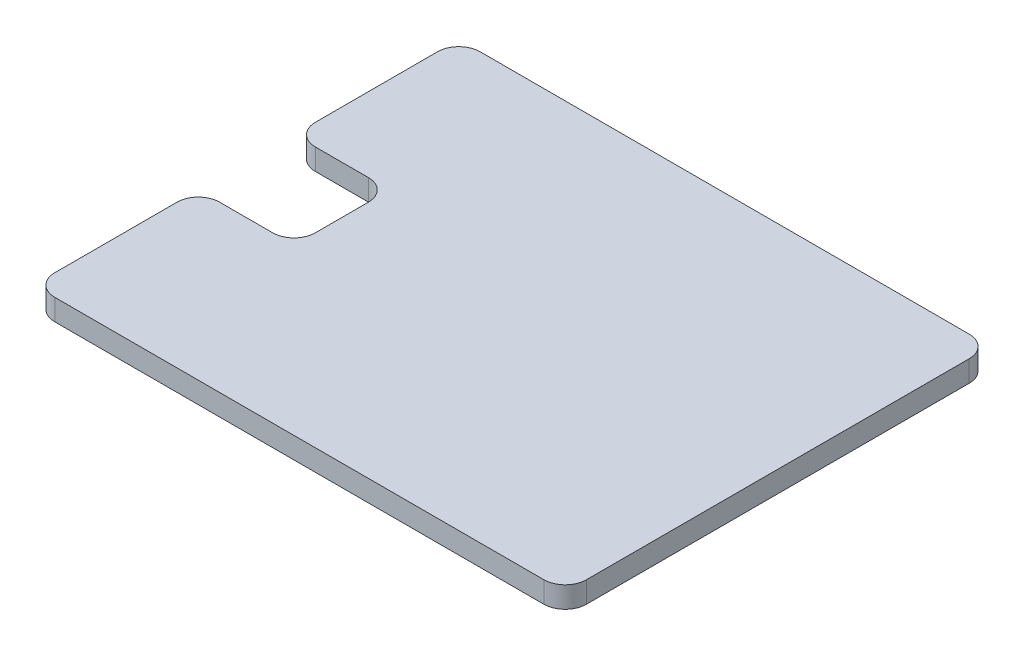
ISO-10303-21;
HEADER;
FILE_DESCRIPTION(('STEP AP214'),'2;1');
FILE_NAME('part.step','',(''),(''),'','','');
FILE_SCHEMA(('AUTOMOTIVE_DESIGN { 1 0 10303 214 1 1 1 1 }'));
ENDSEC;
DATA;
#1=APPLICATION_CONTEXT('core data for automotive mechanical design processes');
#2=APPLICATION_PROTOCOL_DEFINITION('international standard','automotive_design',2000,#1);
#3=PRODUCT_CONTEXT('',#1,'mechanical');
#4=PRODUCT('Part','Part','',(#3));
#5=PRODUCT_RELATED_PRODUCT_CATEGORY('part','',(#4));
#6=PRODUCT_DEFINITION_FORMATION('','',#4);
#7=PRODUCT_DEFINITION_CONTEXT('part definition',#1,'design');
#8=PRODUCT_DEFINITION('design','',#6,#7);
#9=PRODUCT_DEFINITION_SHAPE('','',#8);
#10=(LENGTH_UNIT() NAMED_UNIT(*) SI_UNIT(.MILLI.,.METRE.));
#11=(NAMED_UNIT(*) PLANE_ANGLE_UNIT() SI_UNIT($,.RADIAN.));
#12=(NAMED_UNIT(*) SI_UNIT($,.STERADIAN.) SOLID_ANGLE_UNIT());
#13=UNCERTAINTY_MEASURE_WITH_UNIT(LENGTH_MEASURE(1.E-05),#10,'distance_accuracy_value','');
#14=(GEOMETRIC_REPRESENTATION_CONTEXT(3) GLOBAL_UNCERTAINTY_ASSIGNED_CONTEXT((#13)) GLOBAL_UNIT_ASSIGNED_CONTEXT((#10,
#11,#12)) REPRESENTATION_CONTEXT('',''));
#15=CARTESIAN_POINT('',(0.,0.,0.));
#16=DIRECTION('',(0.,0.,1.));
#17=DIRECTION('',(1.,0.,0.));
#18=AXIS2_PLACEMENT_3D('',#15,#16,#17);
#19=CARTESIAN_POINT('',(0.,13.,0.));
#20=DIRECTION('',(0.,-1.,0.));
#21=DIRECTION('',(0.,0.,-1.));
#22=AXIS2_PLACEMENT_3D('',#19,#20,#21);
#23=PLANE('',#22);
#24=DIRECTION('',(1.,0.,0.));
#25=VECTOR('',#24,1.);
#26=CARTESIAN_POINT('',(0.,13.,16.));
#27=LINE('',#26,#25);
#28=CARTESIAN_POINT('',(-20.5,13.,16.));
#29=VERTEX_POINT('',#28);
#30=CARTESIAN_POINT('',(-15.5,13.,16.));
#31=VERTEX_POINT('',#30);
#32=EDGE_CURVE('E242',#29,#31,#27,.T.);
#33=ORIENTED_EDGE('',*,*,#32,.T.);
#34=DIRECTION('',(0.,0.,-1.));
#35=VECTOR('',#34,1.);
#36=CARTESIAN_POINT('',(-15.5,13.,8.));
#37=LINE('',#36,#35);
#38=CARTESIAN_POINT('',(-15.5,13.,0.));
#39=VERTEX_POINT('',#38);
#40=EDGE_CURVE('E72',#31,#39,#37,.T.);
#41=ORIENTED_EDGE('',*,*,#40,.T.);
#42=DIRECTION('',(1.,0.,0.));
#43=VECTOR('',#42,1.);
#44=CARTESIAN_POINT('',(0.,13.,0.));
#45=LINE('',#44,#43);
#46=CARTESIAN_POINT('',(-20.5,13.,0.));
#47=VERTEX_POINT('',#46);
#48=EDGE_CURVE('E346',#47,#39,#45,.T.);
#49=ORIENTED_EDGE('',*,*,#48,.F.);
#50=DIRECTION('',(0.,0.,-1.));
#51=VECTOR('',#50,1.);
#52=CARTESIAN_POINT('',(-20.5,13.,8.));
#53=LINE('',#52,#51);
#54=CARTESIAN_POINT('',(-20.5,13.,5.5));
#55=VERTEX_POINT('',#54);
#56=EDGE_CURVE('E355',#55,#47,#53,.T.);
#57=ORIENTED_EDGE('',*,*,#56,.F.);
#58=CARTESIAN_POINT('',(-22.5,13.,5.5));
#59=DIRECTION('',(0.,-1.,0.));
#60=DIRECTION('',(0.,0.,-1.));
#61=AXIS2_PLACEMENT_3D('',#58,#59,#60);
#62=CIRCLE('',#61,2.);
#63=CARTESIAN_POINT('',(-22.5,13.,3.5));
#64=VERTEX_POINT('',#63);
#65=EDGE_CURVE('E437',#55,#64,#62,.F.);
#66=ORIENTED_EDGE('',*,*,#65,.T.);
#67=DIRECTION('',(-1.,0.,0.));
#68=VECTOR('',#67,1.);
#69=CARTESIAN_POINT('',(-20.5,13.,3.5));
#70=LINE('',#69,#68);
#71=CARTESIAN_POINT('',(-27.5,13.,3.5));
#72=VERTEX_POINT('',#71);
#73=EDGE_CURVE('E257',#64,#72,#70,.T.);
#74=ORIENTED_EDGE('',*,*,#73,.T.);
#75=CARTESIAN_POINT('',(-27.5,13.,1.5));
#76=DIRECTION('',(0.,-1.,0.));
#77=DIRECTION('',(0.,0.,-1.));
#78=AXIS2_PLACEMENT_3D('',#75,#76,#77);
#79=CIRCLE('',#78,2.);
#80=CARTESIAN_POINT('',(-29.5,13.,1.5));
#81=VERTEX_POINT('',#80);
#82=EDGE_CURVE('E428',#72,#81,#79,.T.);
#83=ORIENTED_EDGE('',*,*,#82,.T.);
#84=DIRECTION('',(0.,0.,1.));
#85=VECTOR('',#84,1.);
#86=CARTESIAN_POINT('',(-29.5,13.,-12.));
#87=LINE('',#86,#85);
#88=CARTESIAN_POINT('',(-29.5,13.,-10.));
#89=VERTEX_POINT('',#88);
#90=EDGE_CURVE('E332',#89,#81,#87,.T.);
#91=ORIENTED_EDGE('',*,*,#90,.F.);
#92=CARTESIAN_POINT('',(-27.5,13.,-10.));
#93=DIRECTION('',(0.,-1.,0.));
#94=DIRECTION('',(0.,0.,-1.));
#95=AXIS2_PLACEMENT_3D('',#92,#93,#94);
#96=CIRCLE('',#95,2.);
#97=CARTESIAN_POINT('',(-27.5,13.,-12.));
#98=VERTEX_POINT('',#97);
#99=EDGE_CURVE('E374',#89,#98,#96,.T.);
#100=ORIENTED_EDGE('',*,*,#99,.T.);
#101=DIRECTION('',(-1.,0.,0.));
#102=VECTOR('',#101,1.);
#103=CARTESIAN_POINT('',(20.5,13.,-12.));
#104=LINE('',#103,#102);
#105=CARTESIAN_POINT('',(18.5,13.,-12.));
#106=VERTEX_POINT('',#105);
#107=EDGE_CURVE('E341',#106,#98,#104,.T.);
#108=ORIENTED_EDGE('',*,*,#107,.F.);
#109=CARTESIAN_POINT('',(18.5,13.,-10.));
#110=DIRECTION('',(0.,-1.,0.));
#111=DIRECTION('',(0.,0.,-1.));
#112=AXIS2_PLACEMENT_3D('',#109,#110,#111);
#113=CIRCLE('',#112,2.);
#114=CARTESIAN_POINT('',(20.5,13.,-10.));
#115=VERTEX_POINT('',#114);
#116=EDGE_CURVE('E378',#106,#115,#113,.T.);
#117=ORIENTED_EDGE('',*,*,#116,.T.);
#118=DIRECTION('',(0.,0.,-1.));
#119=VECTOR('',#118,1.);
#120=CARTESIAN_POINT('',(20.5,13.,-12.));
#121=LINE('',#120,#119);
#122=CARTESIAN_POINT('',(20.5,13.,26.));
#123=VERTEX_POINT('',#122);
#124=EDGE_CURVE('E338',#123,#115,#121,.T.);
#125=ORIENTED_EDGE('',*,*,#124,.F.);
#126=CARTESIAN_POINT('',(18.5,13.,26.));
#127=DIRECTION('',(0.,-1.,0.));
#128=DIRECTION('',(0.,0.,-1.));
#129=AXIS2_PLACEMENT_3D('',#126,#127,#128);
#130=CIRCLE('',#129,2.);
#131=CARTESIAN_POINT('',(18.5,13.,28.));
#132=VERTEX_POINT('',#131);
#133=EDGE_CURVE('E376',#123,#132,#130,.T.);
#134=ORIENTED_EDGE('',*,*,#133,.T.);
#135=DIRECTION('',(1.,0.,0.));
#136=VECTOR('',#135,1.);
#137=CARTESIAN_POINT('',(20.5,13.,28.));
#138=LINE('',#137,#136);
#139=CARTESIAN_POINT('',(-27.5,13.,28.));
#140=VERTEX_POINT('',#139);
#141=EDGE_CURVE('E335',#140,#132,#138,.T.);
#142=ORIENTED_EDGE('',*,*,#141,.F.);
#143=CARTESIAN_POINT('',(-27.5,13.,26.));
#144=DIRECTION('',(0.,-1.,0.));
#145=DIRECTION('',(0.,0.,-1.));
#146=AXIS2_PLACEMENT_3D('',#143,#144,#145);
#147=CIRCLE('',#146,2.);
#148=CARTESIAN_POINT('',(-29.5,13.,26.));
#149=VERTEX_POINT('',#148);
#150=EDGE_CURVE('E371',#140,#149,#147,.T.);
#151=ORIENTED_EDGE('',*,*,#150,.T.);
#152=CARTESIAN_POINT('',(-29.5,13.,14.5));
#153=VERTEX_POINT('',#152);
#154=EDGE_CURVE('E317',#153,#149,#87,.T.);
#155=ORIENTED_EDGE('',*,*,#154,.F.);
#156=CARTESIAN_POINT('',(-27.5,13.,14.5));
#157=DIRECTION('',(0.,-1.,0.));
#158=DIRECTION('',(0.,0.,-1.));
#159=AXIS2_PLACEMENT_3D('',#156,#157,#158);
#160=CIRCLE('',#159,2.);
#161=CARTESIAN_POINT('',(-27.5,13.,12.5));
#162=VERTEX_POINT('',#161);
#163=EDGE_CURVE('E430',#153,#162,#160,.T.);
#164=ORIENTED_EDGE('',*,*,#163,.T.);
#165=DIRECTION('',(1.,0.,0.));
#166=VECTOR('',#165,1.);
#167=CARTESIAN_POINT('',(-20.5,13.,12.5));
#168=LINE('',#167,#166);
#169=CARTESIAN_POINT('',(-22.5,13.,12.5));
#170=VERTEX_POINT('',#169);
#171=EDGE_CURVE('E254',#162,#170,#168,.T.);
#172=ORIENTED_EDGE('',*,*,#171,.T.);
#173=CARTESIAN_POINT('',(-22.5,13.,10.5));
#174=DIRECTION('',(0.,-1.,0.));
#175=DIRECTION('',(0.,0.,-1.));
#176=AXIS2_PLACEMENT_3D('',#173,#174,#175);
#177=CIRCLE('',#176,2.);
#178=CARTESIAN_POINT('',(-20.5,13.,10.5));
#179=VERTEX_POINT('',#178);
#180=EDGE_CURVE('E57',#170,#179,#177,.F.);
#181=ORIENTED_EDGE('',*,*,#180,.T.);
#182=DIRECTION('',(0.,0.,-1.));
#183=VECTOR('',#182,1.);
#184=CARTESIAN_POINT('',(-20.5,13.,16.));
#185=LINE('',#184,#183);
#186=EDGE_CURVE('E64',#29,#179,#185,.T.);
#187=ORIENTED_EDGE('',*,*,#186,.F.);
#188=EDGE_LOOP('',(#33,#41,#49,#57,#66,#74,#83,#91,#100,#108,#117,#125,#134,#142,#151,#155,#164,
#172,#181,#187));
#189=FACE_BOUND('',#188,.T.);
#190=ADVANCED_FACE('F49',(#189),#23,.T.);
#191=CARTESIAN_POINT('',(-29.5,15.,-12.));
#192=DIRECTION('',(1.,0.,0.));
#193=DIRECTION('',(0.,0.,-1.));
#194=AXIS2_PLACEMENT_3D('',#191,#192,#193);
#195=PLANE('',#194);
#196=ORIENTED_EDGE('',*,*,#90,.T.);
#197=DIRECTION('',(0.,1.,0.));
#198=VECTOR('',#197,1.);
#199=CARTESIAN_POINT('',(-29.5,15.,1.5));
#200=LINE('',#199,#198);
#201=CARTESIAN_POINT('',(-29.5,15.,1.5));
#202=VERTEX_POINT('',#201);
#203=EDGE_CURVE('E432',#81,#202,#200,.T.);
#204=ORIENTED_EDGE('',*,*,#203,.T.);
#205=DIRECTION('',(0.,0.,1.));
#206=VECTOR('',#205,1.);
#207=CARTESIAN_POINT('',(-29.5,15.,-12.));
#208=LINE('',#207,#206);
#209=CARTESIAN_POINT('',(-29.5,15.,-10.));
#210=VERTEX_POINT('',#209);
#211=EDGE_CURVE('E318',#210,#202,#208,.T.);
#212=ORIENTED_EDGE('',*,*,#211,.F.);
#213=DIRECTION('',(0.,-1.,0.));
#214=VECTOR('',#213,1.);
#215=CARTESIAN_POINT('',(-29.5,15.,-10.));
#216=LINE('',#215,#214);
#217=EDGE_CURVE('E401',#210,#89,#216,.T.);
#218=ORIENTED_EDGE('',*,*,#217,.T.);
#219=EDGE_LOOP('',(#196,#204,#212,#218));
#220=FACE_BOUND('',#219,.T.);
#221=ADVANCED_FACE('F513',(#220),#195,.F.);
#222=CARTESIAN_POINT('',(0.,0.,0.));
#223=DIRECTION('',(0.,0.,1.));
#224=DIRECTION('',(1.,0.,0.));
#225=AXIS2_PLACEMENT_3D('',#222,#223,#224);
#226=PLANE('',#225);
#227=CARTESIAN_POINT('',(-20.,5.,0.));
#228=DIRECTION('',(0.,0.,1.));
#229=DIRECTION('',(1.,0.,0.));
#230=AXIS2_PLACEMENT_3D('',#227,#228,#229);
#231=CIRCLE('',#230,5.);
#232=CARTESIAN_POINT('',(-21.2924849189812,9.83006032407528,0.));
#233=VERTEX_POINT('',#232);
#234=CARTESIAN_POINT('',(-16.58660256604,8.65358973583999,0.));
#235=VERTEX_POINT('',#234);
#236=EDGE_CURVE('E331',#233,#235,#231,.T.);
#237=ORIENTED_EDGE('',*,*,#236,.F.);
#238=DIRECTION('',(0.242535625036333,0.970142500145332,0.));
#239=VECTOR('',#238,1.);
#240=CARTESIAN_POINT('',(-22.3529411764706,5.58823529411764,0.));
#241=LINE('',#240,#239);
#242=EDGE_CURVE('E350',#233,#47,#241,.T.);
#243=ORIENTED_EDGE('',*,*,#242,.T.);
#244=ORIENTED_EDGE('',*,*,#48,.T.);
#245=DIRECTION('',(0.242535625036333,0.970142500145332,0.));
#246=VECTOR('',#245,1.);
#247=CARTESIAN_POINT('',(-17.6470588235294,4.41176470588235,0.));
#248=LINE('',#247,#246);
#249=EDGE_CURVE('E344',#235,#39,#248,.T.);
#250=ORIENTED_EDGE('',*,*,#249,.F.);
#251=EDGE_LOOP('',(#237,#243,#244,#250));
#252=FACE_BOUND('',#251,.T.);
#253=DIRECTION('',(-1.,0.,0.));
#254=VECTOR('',#253,1.);
#255=CARTESIAN_POINT('',(-18.375,7.81458256229942,0.));
#256=LINE('',#255,#254);
#257=CARTESIAN_POINT('',(-18.375,7.81458256229942,0.));
#258=VERTEX_POINT('',#257);
#259=CARTESIAN_POINT('',(-21.625,7.81458256229942,0.));
#260=VERTEX_POINT('',#259);
#261=EDGE_CURVE('E272',#258,#260,#256,.T.);
#262=ORIENTED_EDGE('',*,*,#261,.T.);
#263=DIRECTION('',(-0.5,-0.866025403784439,0.));
#264=VECTOR('',#263,1.);
#265=CARTESIAN_POINT('',(-21.625,7.81458256229942,0.));
#266=LINE('',#265,#264);
#267=CARTESIAN_POINT('',(-23.25,5.,0.));
#268=VERTEX_POINT('',#267);
#269=EDGE_CURVE('E290',#260,#268,#266,.T.);
#270=ORIENTED_EDGE('',*,*,#269,.T.);
#271=DIRECTION('',(0.500000000000001,-0.866025403784438,0.));
#272=VECTOR('',#271,1.);
#273=CARTESIAN_POINT('',(-23.25,5.,0.));
#274=LINE('',#273,#272);
#275=CARTESIAN_POINT('',(-21.625,2.18541743770057,0.));
#276=VERTEX_POINT('',#275);
#277=EDGE_CURVE('E293',#268,#276,#274,.T.);
#278=ORIENTED_EDGE('',*,*,#277,.T.);
#279=DIRECTION('',(1.,0.,0.));
#280=VECTOR('',#279,1.);
#281=CARTESIAN_POINT('',(-21.625,2.18541743770057,0.));
#282=LINE('',#281,#280);
#283=CARTESIAN_POINT('',(-18.375,2.18541743770057,0.));
#284=VERTEX_POINT('',#283);
#285=EDGE_CURVE('E296',#276,#284,#282,.T.);
#286=ORIENTED_EDGE('',*,*,#285,.T.);
#287=DIRECTION('',(0.5,0.866025403784439,0.));
#288=VECTOR('',#287,1.);
#289=CARTESIAN_POINT('',(-18.375,2.18541743770057,0.));
#290=LINE('',#289,#288);
#291=CARTESIAN_POINT('',(-16.75,5.,0.));
#292=VERTEX_POINT('',#291);
#293=EDGE_CURVE('E299',#284,#292,#290,.T.);
#294=ORIENTED_EDGE('',*,*,#293,.T.);
#295=DIRECTION('',(-0.5,0.866025403784439,0.));
#296=VECTOR('',#295,1.);
#297=CARTESIAN_POINT('',(-16.75,5.,0.));
#298=LINE('',#297,#296);
#299=EDGE_CURVE('E277',#292,#258,#298,.T.);
#300=ORIENTED_EDGE('',*,*,#299,.T.);
#301=EDGE_LOOP('',(#262,#270,#278,#286,#294,#300));
#302=FACE_BOUND('',#301,.T.);
#303=ADVANCED_FACE('F489',(#252,#302),#226,.F.);
#304=CARTESIAN_POINT('',(-17.6470588235294,4.41176470588235,8.));
#305=DIRECTION('',(-0.970142500145332,0.242535625036333,0.));
#306=DIRECTION('',(-0.242535625036333,-0.970142500145332,0.));
#307=AXIS2_PLACEMENT_3D('',#304,#305,#306);
#308=PLANE('',#307);
#309=ORIENTED_EDGE('',*,*,#249,.T.);
#310=ORIENTED_EDGE('',*,*,#40,.F.);
#311=DIRECTION('',(0.242535625036333,0.970142500145332,0.));
#312=VECTOR('',#311,1.);
#313=CARTESIAN_POINT('',(-17.6470588235294,4.41176470588235,16.));
#314=LINE('',#313,#312);
#315=CARTESIAN_POINT('',(-16.58660256604,8.65358973583999,16.));
#316=VERTEX_POINT('',#315);
#317=EDGE_CURVE('E239',#316,#31,#314,.T.);
#318=ORIENTED_EDGE('',*,*,#317,.F.);
#319=DIRECTION('',(0.,0.,-1.));
#320=VECTOR('',#319,1.);
#321=CARTESIAN_POINT('',(-16.58660256604,8.65358973583999,16.));
#322=LINE('',#321,#320);
#323=CARTESIAN_POINT('',(-16.58660256604,8.65358973583999,8.));
#324=VERTEX_POINT('',#323);
#325=EDGE_CURVE('E230',#316,#324,#322,.T.);
#326=ORIENTED_EDGE('',*,*,#325,.T.);
#327=DIRECTION('',(0.,0.,-1.));
#328=VECTOR('',#327,1.);
#329=CARTESIAN_POINT('',(-16.58660256604,8.65358973583999,8.));
#330=LINE('',#329,#328);
#331=EDGE_CURVE('E360',#324,#235,#330,.T.);
#332=ORIENTED_EDGE('',*,*,#331,.T.);
#333=EDGE_LOOP('',(#309,#310,#318,#326,#332));
#334=FACE_BOUND('',#333,.T.);
#335=ADVANCED_FACE('F240',(#334),#308,.F.);
#336=CARTESIAN_POINT('',(-22.3529411764706,5.58823529411764,8.));
#337=DIRECTION('',(-0.970142500145332,0.242535625036333,0.));
#338=DIRECTION('',(-0.242535625036333,-0.970142500145332,0.));
#339=AXIS2_PLACEMENT_3D('',#336,#337,#338);
#340=PLANE('',#339);
#341=ORIENTED_EDGE('',*,*,#242,.F.);
#342=DIRECTION('',(0.,0.,-1.));
#343=VECTOR('',#342,1.);
#344=CARTESIAN_POINT('',(-21.2924849189812,9.83006032407528,8.));
#345=LINE('',#344,#343);
#346=CARTESIAN_POINT('',(-21.2924849189812,9.83006032407528,8.));
#347=VERTEX_POINT('',#346);
#348=EDGE_CURVE('E353',#347,#233,#345,.T.);
#349=ORIENTED_EDGE('',*,*,#348,.F.);
#350=DIRECTION('',(0.,0.,-1.));
#351=VECTOR('',#350,1.);
#352=CARTESIAN_POINT('',(-21.2924849189812,9.83006032407528,16.));
#353=LINE('',#352,#351);
#354=CARTESIAN_POINT('',(-21.2924849189812,9.83006032407528,16.));
#355=VERTEX_POINT('',#354);
#356=EDGE_CURVE('E251',#355,#347,#353,.T.);
#357=ORIENTED_EDGE('',*,*,#356,.F.);
#358=DIRECTION('',(0.242535625036333,0.970142500145332,0.));
#359=VECTOR('',#358,1.);
#360=CARTESIAN_POINT('',(-22.3529411764706,5.58823529411764,16.));
#361=LINE('',#360,#359);
#362=EDGE_CURVE('E246',#355,#29,#361,.T.);
#363=ORIENTED_EDGE('',*,*,#362,.T.);
#364=ORIENTED_EDGE('',*,*,#186,.T.);
#365=EDGE_CURVE('E356',#179,#55,#53,.T.);
#366=ORIENTED_EDGE('',*,*,#365,.T.);
#367=ORIENTED_EDGE('',*,*,#56,.T.);
#368=EDGE_LOOP('',(#341,#349,#357,#363,#364,#366,#367));
#369=FACE_BOUND('',#368,.T.);
#370=ADVANCED_FACE('F450',(#369),#340,.T.);
#371=CARTESIAN_POINT('',(0.,0.,8.));
#372=DIRECTION('',(0.,0.,1.));
#373=DIRECTION('',(1.,0.,0.));
#374=AXIS2_PLACEMENT_3D('',#371,#372,#373);
#375=PLANE('',#374);
#376=CARTESIAN_POINT('',(-20.,5.,8.));
#377=DIRECTION('',(0.,0.,1.));
#378=DIRECTION('',(1.,0.,0.));
#379=AXIS2_PLACEMENT_3D('',#376,#377,#378);
#380=CIRCLE('',#379,5.);
#381=EDGE_CURVE('E12',#347,#324,#380,.F.);
#382=ORIENTED_EDGE('',*,*,#381,.F.);
#383=CARTESIAN_POINT('',(-20.,5.,8.));
#384=DIRECTION('',(0.,0.,1.));
#385=DIRECTION('',(1.,0.,0.));
#386=AXIS2_PLACEMENT_3D('',#383,#384,#385);
#387=CIRCLE('',#386,5.);
#388=EDGE_CURVE('E347',#347,#324,#387,.T.);
#389=ORIENTED_EDGE('',*,*,#388,.T.);
#390=EDGE_LOOP('',(#382,#389));
#391=FACE_BOUND('',#390,.T.);
#392=CARTESIAN_POINT('',(-20.,5.,8.));
#393=DIRECTION('',(0.,0.,1.));
#394=DIRECTION('',(1.,0.,0.));
#395=AXIS2_PLACEMENT_3D('',#392,#393,#394);
#396=CIRCLE('',#395,1.6);
#397=CARTESIAN_POINT('',(-18.4,5.,8.));
#398=VERTEX_POINT('',#397);
#399=EDGE_CURVE('E269',#398,#398,#396,.T.);
#400=ORIENTED_EDGE('',*,*,#399,.F.);
#401=EDGE_LOOP('',(#400));
#402=FACE_BOUND('',#401,.T.);
#403=ADVANCED_FACE('F458',(#391,#402),#375,.T.);
#404=CARTESIAN_POINT('',(-20.,5.,8.));
#405=DIRECTION('',(0.,0.,-1.));
#406=DIRECTION('',(-1.,0.,0.));
#407=AXIS2_PLACEMENT_3D('',#404,#405,#406);
#408=CYLINDRICAL_SURFACE('',#407,5.);
#409=ORIENTED_EDGE('',*,*,#236,.T.);
#410=ORIENTED_EDGE('',*,*,#331,.F.);
#411=ORIENTED_EDGE('',*,*,#388,.F.);
#412=ORIENTED_EDGE('',*,*,#348,.T.);
#413=EDGE_LOOP('',(#409,#410,#411,#412));
#414=FACE_BOUND('',#413,.T.);
#415=ADVANCED_FACE('F456',(#414),#408,.T.);
#416=CARTESIAN_POINT('',(-29.5,15.,14.5));
#417=VERTEX_POINT('',#416);
#418=CARTESIAN_POINT('',(-29.5,15.,26.));
#419=VERTEX_POINT('',#418);
#420=EDGE_CURVE('E322',#417,#419,#208,.T.);
#421=ORIENTED_EDGE('',*,*,#420,.F.);
#422=DIRECTION('',(0.,1.,0.));
#423=VECTOR('',#422,1.);
#424=CARTESIAN_POINT('',(-29.5,15.,14.5));
#425=LINE('',#424,#423);
#426=EDGE_CURVE('E426',#417,#153,#425,.F.);
#427=ORIENTED_EDGE('',*,*,#426,.T.);
#428=ORIENTED_EDGE('',*,*,#154,.T.);
#429=DIRECTION('',(0.,-1.,0.));
#430=VECTOR('',#429,1.);
#431=CARTESIAN_POINT('',(-29.5,15.,26.));
#432=LINE('',#431,#430);
#433=EDGE_CURVE('E398',#149,#419,#432,.F.);
#434=ORIENTED_EDGE('',*,*,#433,.T.);
#435=EDGE_LOOP('',(#421,#427,#428,#434));
#436=FACE_BOUND('',#435,.T.);
#437=ADVANCED_FACE('F520',(#436),#195,.F.);
#438=CARTESIAN_POINT('',(20.5,15.,28.));
#439=DIRECTION('',(0.,0.,-1.));
#440=DIRECTION('',(-1.,0.,0.));
#441=AXIS2_PLACEMENT_3D('',#438,#439,#440);
#442=PLANE('',#441);
#443=ORIENTED_EDGE('',*,*,#141,.T.);
#444=DIRECTION('',(0.,-1.,0.));
#445=VECTOR('',#444,1.);
#446=CARTESIAN_POINT('',(18.5,15.,28.));
#447=LINE('',#446,#445);
#448=CARTESIAN_POINT('',(18.5,15.,28.));
#449=VERTEX_POINT('',#448);
#450=EDGE_CURVE('E396',#132,#449,#447,.F.);
#451=ORIENTED_EDGE('',*,*,#450,.T.);
#452=DIRECTION('',(1.,0.,0.));
#453=VECTOR('',#452,1.);
#454=CARTESIAN_POINT('',(20.5,15.,28.));
#455=LINE('',#454,#453);
#456=CARTESIAN_POINT('',(-27.5,15.,28.));
#457=VERTEX_POINT('',#456);
#458=EDGE_CURVE('E321',#457,#449,#455,.T.);
#459=ORIENTED_EDGE('',*,*,#458,.F.);
#460=DIRECTION('',(0.,-1.,0.));
#461=VECTOR('',#460,1.);
#462=CARTESIAN_POINT('',(-27.5,15.,28.));
#463=LINE('',#462,#461);
#464=EDGE_CURVE('E393',#457,#140,#463,.T.);
#465=ORIENTED_EDGE('',*,*,#464,.T.);
#466=EDGE_LOOP('',(#443,#451,#459,#465));
#467=FACE_BOUND('',#466,.T.);
#468=ADVANCED_FACE('F532',(#467),#442,.F.);
#469=CARTESIAN_POINT('',(20.5,15.,-12.));
#470=DIRECTION('',(-1.,0.,0.));
#471=DIRECTION('',(0.,0.,1.));
#472=AXIS2_PLACEMENT_3D('',#469,#470,#471);
#473=PLANE('',#472);
#474=ORIENTED_EDGE('',*,*,#124,.T.);
#475=DIRECTION('',(0.,-1.,0.));
#476=VECTOR('',#475,1.);
#477=CARTESIAN_POINT('',(20.5,15.,-10.));
#478=LINE('',#477,#476);
#479=CARTESIAN_POINT('',(20.5,15.,-10.));
#480=VERTEX_POINT('',#479);
#481=EDGE_CURVE('E383',#115,#480,#478,.F.);
#482=ORIENTED_EDGE('',*,*,#481,.T.);
#483=DIRECTION('',(0.,0.,-1.));
#484=VECTOR('',#483,1.);
#485=CARTESIAN_POINT('',(20.5,15.,-12.));
#486=LINE('',#485,#484);
#487=CARTESIAN_POINT('',(20.5,15.,26.));
#488=VERTEX_POINT('',#487);
#489=EDGE_CURVE('E325',#488,#480,#486,.T.);
#490=ORIENTED_EDGE('',*,*,#489,.F.);
#491=DIRECTION('',(0.,-1.,0.));
#492=VECTOR('',#491,1.);
#493=CARTESIAN_POINT('',(20.5,15.,26.));
#494=LINE('',#493,#492);
#495=EDGE_CURVE('E380',#488,#123,#494,.T.);
#496=ORIENTED_EDGE('',*,*,#495,.T.);
#497=EDGE_LOOP('',(#474,#482,#490,#496));
#498=FACE_BOUND('',#497,.T.);
#499=ADVANCED_FACE('F528',(#498),#473,.F.);
#500=CARTESIAN_POINT('',(20.5,15.,-12.));
#501=DIRECTION('',(0.,0.,1.));
#502=DIRECTION('',(1.,0.,0.));
#503=AXIS2_PLACEMENT_3D('',#500,#501,#502);
#504=PLANE('',#503);
#505=DIRECTION('',(-1.,0.,0.));
#506=VECTOR('',#505,1.);
#507=CARTESIAN_POINT('',(20.5,15.,-12.));
#508=LINE('',#507,#506);
#509=CARTESIAN_POINT('',(18.5,15.,-12.));
#510=VERTEX_POINT('',#509);
#511=CARTESIAN_POINT('',(-27.5,15.,-12.));
#512=VERTEX_POINT('',#511);
#513=EDGE_CURVE('E328',#510,#512,#508,.T.);
#514=ORIENTED_EDGE('',*,*,#513,.F.);
#515=DIRECTION('',(0.,-1.,0.));
#516=VECTOR('',#515,1.);
#517=CARTESIAN_POINT('',(18.5,15.,-12.));
#518=LINE('',#517,#516);
#519=EDGE_CURVE('E368',#510,#106,#518,.T.);
#520=ORIENTED_EDGE('',*,*,#519,.T.);
#521=ORIENTED_EDGE('',*,*,#107,.T.);
#522=DIRECTION('',(0.,-1.,0.));
#523=VECTOR('',#522,1.);
#524=CARTESIAN_POINT('',(-27.5,15.,-12.));
#525=LINE('',#524,#523);
#526=EDGE_CURVE('E362',#98,#512,#525,.F.);
#527=ORIENTED_EDGE('',*,*,#526,.T.);
#528=EDGE_LOOP('',(#514,#520,#521,#527));
#529=FACE_BOUND('',#528,.T.);
#530=ADVANCED_FACE('F525',(#529),#504,.F.);
#531=CARTESIAN_POINT('',(0.,15.,0.));
#532=DIRECTION('',(0.,-1.,0.));
#533=DIRECTION('',(0.,0.,-1.));
#534=AXIS2_PLACEMENT_3D('',#531,#532,#533);
#535=PLANE('',#534);
#536=DIRECTION('',(1.,0.,0.));
#537=VECTOR('',#536,1.);
#538=CARTESIAN_POINT('',(-20.5,15.,12.5));
#539=LINE('',#538,#537);
#540=CARTESIAN_POINT('',(-27.5,15.,12.5));
#541=VERTEX_POINT('',#540);
#542=CARTESIAN_POINT('',(-22.5,15.,12.5));
#543=VERTEX_POINT('',#542);
#544=EDGE_CURVE('E236',#541,#543,#539,.T.);
#545=ORIENTED_EDGE('',*,*,#544,.F.);
#546=CARTESIAN_POINT('',(-27.5,15.,14.5));
#547=DIRECTION('',(0.,-1.,0.));
#548=DIRECTION('',(0.,0.,-1.));
#549=AXIS2_PLACEMENT_3D('',#546,#547,#548);
#550=CIRCLE('',#549,2.);
#551=EDGE_CURVE('E424',#541,#417,#550,.F.);
#552=ORIENTED_EDGE('',*,*,#551,.T.);
#553=ORIENTED_EDGE('',*,*,#420,.T.);
#554=CARTESIAN_POINT('',(-27.5,15.,26.));
#555=DIRECTION('',(0.,-1.,0.));
#556=DIRECTION('',(0.,0.,-1.));
#557=AXIS2_PLACEMENT_3D('',#554,#555,#556);
#558=CIRCLE('',#557,2.);
#559=EDGE_CURVE('E385',#419,#457,#558,.F.);
#560=ORIENTED_EDGE('',*,*,#559,.T.);
#561=ORIENTED_EDGE('',*,*,#458,.T.);
#562=CARTESIAN_POINT('',(18.5,15.,26.));
#563=DIRECTION('',(0.,-1.,0.));
#564=DIRECTION('',(0.,0.,-1.));
#565=AXIS2_PLACEMENT_3D('',#562,#563,#564);
#566=CIRCLE('',#565,2.);
#567=EDGE_CURVE('E389',#449,#488,#566,.F.);
#568=ORIENTED_EDGE('',*,*,#567,.T.);
#569=ORIENTED_EDGE('',*,*,#489,.T.);
#570=CARTESIAN_POINT('',(18.5,15.,-10.));
#571=DIRECTION('',(0.,-1.,0.));
#572=DIRECTION('',(0.,0.,-1.));
#573=AXIS2_PLACEMENT_3D('',#570,#571,#572);
#574=CIRCLE('',#573,2.);
#575=EDGE_CURVE('E391',#480,#510,#574,.F.);
#576=ORIENTED_EDGE('',*,*,#575,.T.);
#577=ORIENTED_EDGE('',*,*,#513,.T.);
#578=CARTESIAN_POINT('',(-27.5,15.,-10.));
#579=DIRECTION('',(0.,-1.,0.));
#580=DIRECTION('',(0.,0.,-1.));
#581=AXIS2_PLACEMENT_3D('',#578,#579,#580);
#582=CIRCLE('',#581,2.);
#583=EDGE_CURVE('E387',#512,#210,#582,.F.);
#584=ORIENTED_EDGE('',*,*,#583,.T.);
#585=ORIENTED_EDGE('',*,*,#211,.T.);
#586=CARTESIAN_POINT('',(-27.5,15.,1.5));
#587=DIRECTION('',(0.,-1.,0.));
#588=DIRECTION('',(0.,0.,-1.));
#589=AXIS2_PLACEMENT_3D('',#586,#587,#588);
#590=CIRCLE('',#589,2.);
#591=CARTESIAN_POINT('',(-27.5,15.,3.5));
#592=VERTEX_POINT('',#591);
#593=EDGE_CURVE('E422',#202,#592,#590,.F.);
#594=ORIENTED_EDGE('',*,*,#593,.T.);
#595=DIRECTION('',(-1.,0.,0.));
#596=VECTOR('',#595,1.);
#597=CARTESIAN_POINT('',(-20.5,15.,3.5));
#598=LINE('',#597,#596);
#599=CARTESIAN_POINT('',(-22.5,15.,3.5));
#600=VERTEX_POINT('',#599);
#601=EDGE_CURVE('E258',#600,#592,#598,.T.);
#602=ORIENTED_EDGE('',*,*,#601,.F.);
#603=CARTESIAN_POINT('',(-22.5,15.,5.5));
#604=DIRECTION('',(0.,-1.,0.));
#605=DIRECTION('',(0.,0.,-1.));
#606=AXIS2_PLACEMENT_3D('',#603,#604,#605);
#607=CIRCLE('',#606,2.);
#608=CARTESIAN_POINT('',(-20.5,15.,5.5));
#609=VERTEX_POINT('',#608);
#610=EDGE_CURVE('E435',#600,#609,#607,.T.);
#611=ORIENTED_EDGE('',*,*,#610,.T.);
#612=DIRECTION('',(0.,0.,-1.));
#613=VECTOR('',#612,1.);
#614=CARTESIAN_POINT('',(-20.5,15.,3.5));
#615=LINE('',#614,#613);
#616=CARTESIAN_POINT('',(-20.5,15.,10.5));
#617=VERTEX_POINT('',#616);
#618=EDGE_CURVE('E264',#617,#609,#615,.T.);
#619=ORIENTED_EDGE('',*,*,#618,.F.);
#620=CARTESIAN_POINT('',(-22.5,15.,10.5));
#621=DIRECTION('',(0.,-1.,0.));
#622=DIRECTION('',(0.,0.,-1.));
#623=AXIS2_PLACEMENT_3D('',#620,#621,#622);
#624=CIRCLE('',#623,2.);
#625=EDGE_CURVE('E439',#617,#543,#624,.T.);
#626=ORIENTED_EDGE('',*,*,#625,.T.);
#627=EDGE_LOOP('',(#545,#552,#553,#560,#561,#568,#569,#576,#577,#584,#585,#594,#602,#611,#619,#626));
#628=FACE_BOUND('',#627,.T.);
#629=ADVANCED_FACE('F523',(#628),#535,.F.);
#630=CARTESIAN_POINT('',(18.5,15.,-10.));
#631=DIRECTION('',(0.,-1.,0.));
#632=DIRECTION('',(0.,0.,-1.));
#633=AXIS2_PLACEMENT_3D('',#630,#631,#632);
#634=CYLINDRICAL_SURFACE('',#633,2.);
#635=ORIENTED_EDGE('',*,*,#575,.F.);
#636=ORIENTED_EDGE('',*,*,#481,.F.);
#637=ORIENTED_EDGE('',*,*,#116,.F.);
#638=ORIENTED_EDGE('',*,*,#519,.F.);
#639=EDGE_LOOP('',(#635,#636,#637,#638));
#640=FACE_BOUND('',#639,.T.);
#641=ADVANCED_FACE('F548',(#640),#634,.T.);
#642=CARTESIAN_POINT('',(18.5,15.,26.));
#643=DIRECTION('',(0.,-1.,0.));
#644=DIRECTION('',(0.,0.,-1.));
#645=AXIS2_PLACEMENT_3D('',#642,#643,#644);
#646=CYLINDRICAL_SURFACE('',#645,2.);
#647=ORIENTED_EDGE('',*,*,#567,.F.);
#648=ORIENTED_EDGE('',*,*,#450,.F.);
#649=ORIENTED_EDGE('',*,*,#133,.F.);
#650=ORIENTED_EDGE('',*,*,#495,.F.);
#651=EDGE_LOOP('',(#647,#648,#649,#650));
#652=FACE_BOUND('',#651,.T.);
#653=ADVANCED_FACE('F551',(#652),#646,.T.);
#654=CARTESIAN_POINT('',(-27.5,15.,-10.));
#655=DIRECTION('',(0.,-1.,0.));
#656=DIRECTION('',(0.,0.,-1.));
#657=AXIS2_PLACEMENT_3D('',#654,#655,#656);
#658=CYLINDRICAL_SURFACE('',#657,2.);
#659=ORIENTED_EDGE('',*,*,#583,.F.);
#660=ORIENTED_EDGE('',*,*,#526,.F.);
#661=ORIENTED_EDGE('',*,*,#99,.F.);
#662=ORIENTED_EDGE('',*,*,#217,.F.);
#663=EDGE_LOOP('',(#659,#660,#661,#662));
#664=FACE_BOUND('',#663,.T.);
#665=ADVANCED_FACE('F555',(#664),#658,.T.);
#666=CARTESIAN_POINT('',(-27.5,15.,26.));
#667=DIRECTION('',(0.,-1.,0.));
#668=DIRECTION('',(0.,0.,-1.));
#669=AXIS2_PLACEMENT_3D('',#666,#667,#668);
#670=CYLINDRICAL_SURFACE('',#669,2.);
#671=ORIENTED_EDGE('',*,*,#559,.F.);
#672=ORIENTED_EDGE('',*,*,#433,.F.);
#673=ORIENTED_EDGE('',*,*,#150,.F.);
#674=ORIENTED_EDGE('',*,*,#464,.F.);
#675=EDGE_LOOP('',(#671,#672,#673,#674));
#676=FACE_BOUND('',#675,.T.);
#677=ADVANCED_FACE('F559',(#676),#670,.T.);
#678=CARTESIAN_POINT('',(-18.375,7.81458256229942,3.));
#679=DIRECTION('',(0.,-1.,0.));
#680=DIRECTION('',(0.,0.,-1.));
#681=AXIS2_PLACEMENT_3D('',#678,#679,#680);
#682=PLANE('',#681);
#683=ORIENTED_EDGE('',*,*,#261,.F.);
#684=DIRECTION('',(0.,0.,-1.));
#685=VECTOR('',#684,1.);
#686=CARTESIAN_POINT('',(-18.375,7.81458256229942,3.));
#687=LINE('',#686,#685);
#688=CARTESIAN_POINT('',(-18.375,7.81458256229942,3.));
#689=VERTEX_POINT('',#688);
#690=EDGE_CURVE('E287',#689,#258,#687,.T.);
#691=ORIENTED_EDGE('',*,*,#690,.F.);
#692=DIRECTION('',(-1.,0.,0.));
#693=VECTOR('',#692,1.);
#694=CARTESIAN_POINT('',(-18.375,7.81458256229942,3.));
#695=LINE('',#694,#693);
#696=CARTESIAN_POINT('',(-21.625,7.81458256229942,3.));
#697=VERTEX_POINT('',#696);
#698=EDGE_CURVE('E273',#689,#697,#695,.T.);
#699=ORIENTED_EDGE('',*,*,#698,.T.);
#700=DIRECTION('',(0.,0.,-1.));
#701=VECTOR('',#700,1.);
#702=CARTESIAN_POINT('',(-21.625,7.81458256229942,3.));
#703=LINE('',#702,#701);
#704=EDGE_CURVE('E314',#697,#260,#703,.T.);
#705=ORIENTED_EDGE('',*,*,#704,.T.);
#706=EDGE_LOOP('',(#683,#691,#699,#705));
#707=FACE_BOUND('',#706,.T.);
#708=ADVANCED_FACE('F483',(#707),#682,.T.);
#709=CARTESIAN_POINT('',(-21.625,7.81458256229942,3.));
#710=DIRECTION('',(0.866025403784439,-0.5,0.));
#711=DIRECTION('',(0.5,0.866025403784439,0.));
#712=AXIS2_PLACEMENT_3D('',#709,#710,#711);
#713=PLANE('',#712);
#714=ORIENTED_EDGE('',*,*,#269,.F.);
#715=ORIENTED_EDGE('',*,*,#704,.F.);
#716=DIRECTION('',(-0.5,-0.866025403784439,0.));
#717=VECTOR('',#716,1.);
#718=CARTESIAN_POINT('',(-21.625,7.81458256229942,3.));
#719=LINE('',#718,#717);
#720=CARTESIAN_POINT('',(-23.25,5.,3.));
#721=VERTEX_POINT('',#720);
#722=EDGE_CURVE('E276',#697,#721,#719,.T.);
#723=ORIENTED_EDGE('',*,*,#722,.T.);
#724=DIRECTION('',(0.,0.,-1.));
#725=VECTOR('',#724,1.);
#726=CARTESIAN_POINT('',(-23.25,5.,3.));
#727=LINE('',#726,#725);
#728=EDGE_CURVE('E312',#721,#268,#727,.T.);
#729=ORIENTED_EDGE('',*,*,#728,.T.);
#730=EDGE_LOOP('',(#714,#715,#723,#729));
#731=FACE_BOUND('',#730,.T.);
#732=ADVANCED_FACE('F485',(#731),#713,.T.);
#733=CARTESIAN_POINT('',(-23.25,5.,3.));
#734=DIRECTION('',(0.866025403784438,0.500000000000001,0.));
#735=DIRECTION('',(-0.500000000000001,0.866025403784438,0.));
#736=AXIS2_PLACEMENT_3D('',#733,#734,#735);
#737=PLANE('',#736);
#738=ORIENTED_EDGE('',*,*,#277,.F.);
#739=ORIENTED_EDGE('',*,*,#728,.F.);
#740=DIRECTION('',(0.500000000000001,-0.866025403784438,0.));
#741=VECTOR('',#740,1.);
#742=CARTESIAN_POINT('',(-23.25,5.,3.));
#743=LINE('',#742,#741);
#744=CARTESIAN_POINT('',(-21.625,2.18541743770057,3.));
#745=VERTEX_POINT('',#744);
#746=EDGE_CURVE('E279',#721,#745,#743,.T.);
#747=ORIENTED_EDGE('',*,*,#746,.T.);
#748=DIRECTION('',(0.,0.,-1.));
#749=VECTOR('',#748,1.);
#750=CARTESIAN_POINT('',(-21.625,2.18541743770057,3.));
#751=LINE('',#750,#749);
#752=EDGE_CURVE('E310',#745,#276,#751,.T.);
#753=ORIENTED_EDGE('',*,*,#752,.T.);
#754=EDGE_LOOP('',(#738,#739,#747,#753));
#755=FACE_BOUND('',#754,.T.);
#756=ADVANCED_FACE('F503',(#755),#737,.T.);
#757=CARTESIAN_POINT('',(-21.625,2.18541743770057,3.));
#758=DIRECTION('',(0.,1.,0.));
#759=DIRECTION('',(0.,0.,1.));
#760=AXIS2_PLACEMENT_3D('',#757,#758,#759);
#761=PLANE('',#760);
#762=ORIENTED_EDGE('',*,*,#285,.F.);
#763=ORIENTED_EDGE('',*,*,#752,.F.);
#764=DIRECTION('',(1.,0.,0.));
#765=VECTOR('',#764,1.);
#766=CARTESIAN_POINT('',(-21.625,2.18541743770057,3.));
#767=LINE('',#766,#765);
#768=CARTESIAN_POINT('',(-18.375,2.18541743770057,3.));
#769=VERTEX_POINT('',#768);
#770=EDGE_CURVE('E281',#745,#769,#767,.T.);
#771=ORIENTED_EDGE('',*,*,#770,.T.);
#772=DIRECTION('',(0.,0.,-1.));
#773=VECTOR('',#772,1.);
#774=CARTESIAN_POINT('',(-18.375,2.18541743770057,3.));
#775=LINE('',#774,#773);
#776=EDGE_CURVE('E308',#769,#284,#775,.T.);
#777=ORIENTED_EDGE('',*,*,#776,.T.);
#778=EDGE_LOOP('',(#762,#763,#771,#777));
#779=FACE_BOUND('',#778,.T.);
#780=ADVANCED_FACE('F501',(#779),#761,.T.);
#781=CARTESIAN_POINT('',(-18.375,2.18541743770057,3.));
#782=DIRECTION('',(-0.866025403784439,0.5,0.));
#783=DIRECTION('',(-0.5,-0.866025403784439,0.));
#784=AXIS2_PLACEMENT_3D('',#781,#782,#783);
#785=PLANE('',#784);
#786=ORIENTED_EDGE('',*,*,#293,.F.);
#787=ORIENTED_EDGE('',*,*,#776,.F.);
#788=DIRECTION('',(0.5,0.866025403784439,0.));
#789=VECTOR('',#788,1.);
#790=CARTESIAN_POINT('',(-18.375,2.18541743770057,3.));
#791=LINE('',#790,#789);
#792=CARTESIAN_POINT('',(-16.75,5.,3.));
#793=VERTEX_POINT('',#792);
#794=EDGE_CURVE('E283',#769,#793,#791,.T.);
#795=ORIENTED_EDGE('',*,*,#794,.T.);
#796=DIRECTION('',(0.,0.,-1.));
#797=VECTOR('',#796,1.);
#798=CARTESIAN_POINT('',(-16.75,5.,3.));
#799=LINE('',#798,#797);
#800=EDGE_CURVE('E306',#793,#292,#799,.T.);
#801=ORIENTED_EDGE('',*,*,#800,.T.);
#802=EDGE_LOOP('',(#786,#787,#795,#801));
#803=FACE_BOUND('',#802,.T.);
#804=ADVANCED_FACE('F495',(#803),#785,.T.);
#805=CARTESIAN_POINT('',(-16.75,5.,3.));
#806=DIRECTION('',(-0.866025403784439,-0.5,0.));
#807=DIRECTION('',(0.5,-0.866025403784439,0.));
#808=AXIS2_PLACEMENT_3D('',#805,#806,#807);
#809=PLANE('',#808);
#810=ORIENTED_EDGE('',*,*,#299,.F.);
#811=ORIENTED_EDGE('',*,*,#800,.F.);
#812=DIRECTION('',(-0.5,0.866025403784439,0.));
#813=VECTOR('',#812,1.);
#814=CARTESIAN_POINT('',(-16.75,5.,3.));
#815=LINE('',#814,#813);
#816=EDGE_CURVE('E285',#793,#689,#815,.T.);
#817=ORIENTED_EDGE('',*,*,#816,.T.);
#818=ORIENTED_EDGE('',*,*,#690,.T.);
#819=EDGE_LOOP('',(#810,#811,#817,#818));
#820=FACE_BOUND('',#819,.T.);
#821=ADVANCED_FACE('F474',(#820),#809,.T.);
#822=CARTESIAN_POINT('',(0.,0.,3.));
#823=DIRECTION('',(0.,0.,1.));
#824=DIRECTION('',(1.,0.,0.));
#825=AXIS2_PLACEMENT_3D('',#822,#823,#824);
#826=PLANE('',#825);
#827=CARTESIAN_POINT('',(-20.,5.,3.));
#828=DIRECTION('',(0.,0.,1.));
#829=DIRECTION('',(1.,0.,0.));
#830=AXIS2_PLACEMENT_3D('',#827,#828,#829);
#831=CIRCLE('',#830,1.6);
#832=CARTESIAN_POINT('',(-18.4,5.,3.));
#833=VERTEX_POINT('',#832);
#834=EDGE_CURVE('E261',#833,#833,#831,.T.);
#835=ORIENTED_EDGE('',*,*,#834,.T.);
#836=EDGE_LOOP('',(#835));
#837=FACE_BOUND('',#836,.T.);
#838=ORIENTED_EDGE('',*,*,#698,.F.);
#839=ORIENTED_EDGE('',*,*,#816,.F.);
#840=ORIENTED_EDGE('',*,*,#794,.F.);
#841=ORIENTED_EDGE('',*,*,#770,.F.);
#842=ORIENTED_EDGE('',*,*,#746,.F.);
#843=ORIENTED_EDGE('',*,*,#722,.F.);
#844=EDGE_LOOP('',(#838,#839,#840,#841,#842,#843));
#845=FACE_BOUND('',#844,.T.);
#846=ADVANCED_FACE('F468',(#837,#845),#826,.F.);
#847=CARTESIAN_POINT('',(-20.,5.,-12.));
#848=DIRECTION('',(0.,0.,1.));
#849=DIRECTION('',(1.,0.,0.));
#850=AXIS2_PLACEMENT_3D('',#847,#848,#849);
#851=CYLINDRICAL_SURFACE('',#850,1.6);
#852=CARTESIAN_POINT('',(-18.4,5.,8.));
#853=CARTESIAN_POINT('',(-18.4,5.,7.94791666666667));
#854=CARTESIAN_POINT('',(-18.4,5.,7.89583333333333));
#855=CARTESIAN_POINT('',(-18.4,5.,7.79166666666666));
#856=CARTESIAN_POINT('',(-18.4,5.,7.73958333333333));
#857=CARTESIAN_POINT('',(-18.4,5.,7.63541666666666));
#858=CARTESIAN_POINT('',(-18.4,5.,7.58333333333333));
#859=CARTESIAN_POINT('',(-18.4,5.,7.47916666666666));
#860=CARTESIAN_POINT('',(-18.4,5.,7.42708333333333));
#861=CARTESIAN_POINT('',(-18.4,5.,7.32291666666666));
#862=CARTESIAN_POINT('',(-18.4,5.,7.27083333333333));
#863=CARTESIAN_POINT('',(-18.4,5.,7.16666666666666));
#864=CARTESIAN_POINT('',(-18.4,5.,7.11458333333333));
#865=CARTESIAN_POINT('',(-18.4,5.,7.01041666666666));
#866=CARTESIAN_POINT('',(-18.4,5.,6.95833333333333));
#867=CARTESIAN_POINT('',(-18.4,5.,6.85416666666666));
#868=CARTESIAN_POINT('',(-18.4,5.,6.80208333333333));
#869=CARTESIAN_POINT('',(-18.4,5.,6.69791666666666));
#870=CARTESIAN_POINT('',(-18.4,5.,6.64583333333333));
#871=CARTESIAN_POINT('',(-18.4,5.,6.54166666666666));
#872=CARTESIAN_POINT('',(-18.4,5.,6.48958333333333));
#873=CARTESIAN_POINT('',(-18.4,5.,6.38541666666666));
#874=CARTESIAN_POINT('',(-18.4,5.,6.33333333333333));
#875=CARTESIAN_POINT('',(-18.4,5.,6.22916666666666));
#876=CARTESIAN_POINT('',(-18.4,5.,6.17708333333333));
#877=CARTESIAN_POINT('',(-18.4,5.,6.07291666666666));
#878=CARTESIAN_POINT('',(-18.4,5.,6.02083333333333));
#879=CARTESIAN_POINT('',(-18.4,5.,5.91666666666666));
#880=CARTESIAN_POINT('',(-18.4,5.,5.86458333333333));
#881=CARTESIAN_POINT('',(-18.4,5.,5.76041666666666));
#882=CARTESIAN_POINT('',(-18.4,5.,5.70833333333333));
#883=CARTESIAN_POINT('',(-18.4,5.,5.60416666666667));
#884=CARTESIAN_POINT('',(-18.4,5.,5.55208333333333));
#885=CARTESIAN_POINT('',(-18.4,5.,5.44791666666666));
#886=CARTESIAN_POINT('',(-18.4,5.,5.39583333333333));
#887=CARTESIAN_POINT('',(-18.4,5.,5.29166666666667));
#888=CARTESIAN_POINT('',(-18.4,5.,5.23958333333333));
#889=CARTESIAN_POINT('',(-18.4,5.,5.13541666666666));
#890=CARTESIAN_POINT('',(-18.4,5.,5.08333333333333));
#891=CARTESIAN_POINT('',(-18.4,5.,4.97916666666667));
#892=CARTESIAN_POINT('',(-18.4,5.,4.92708333333333));
#893=CARTESIAN_POINT('',(-18.4,5.,4.82291666666667));
#894=CARTESIAN_POINT('',(-18.4,5.,4.77083333333333));
#895=CARTESIAN_POINT('',(-18.4,5.,4.66666666666667));
#896=CARTESIAN_POINT('',(-18.4,5.,4.61458333333333));
#897=CARTESIAN_POINT('',(-18.4,5.,4.51041666666667));
#898=CARTESIAN_POINT('',(-18.4,5.,4.45833333333333));
#899=CARTESIAN_POINT('',(-18.4,5.,4.35416666666667));
#900=CARTESIAN_POINT('',(-18.4,5.,4.30208333333333));
#901=CARTESIAN_POINT('',(-18.4,5.,4.19791666666667));
#902=CARTESIAN_POINT('',(-18.4,5.,4.14583333333333));
#903=CARTESIAN_POINT('',(-18.4,5.,4.04166666666667));
#904=CARTESIAN_POINT('',(-18.4,5.,3.98958333333333));
#905=CARTESIAN_POINT('',(-18.4,5.,3.88541666666667));
#906=CARTESIAN_POINT('',(-18.4,5.,3.83333333333333));
#907=CARTESIAN_POINT('',(-18.4,5.,3.72916666666666));
#908=CARTESIAN_POINT('',(-18.4,5.,3.67708333333333));
#909=CARTESIAN_POINT('',(-18.4,5.,3.57291666666667));
#910=CARTESIAN_POINT('',(-18.4,5.,3.52083333333333));
#911=CARTESIAN_POINT('',(-18.4,5.,3.41666666666667));
#912=CARTESIAN_POINT('',(-18.4,5.,3.36458333333333));
#913=CARTESIAN_POINT('',(-18.4,5.,3.26041666666667));
#914=CARTESIAN_POINT('',(-18.4,5.,3.20833333333333));
#915=CARTESIAN_POINT('',(-18.4,5.,3.10416666666667));
#916=CARTESIAN_POINT('',(-18.4,5.,3.05208333333333));
#917=CARTESIAN_POINT('',(-18.4,5.,3.));
#918=B_SPLINE_CURVE_WITH_KNOTS('',3,(#852,#853,#854,#855,#856,#857,#858,#859,#860,#861,#862,
#863,#864,#865,#866,#867,#868,#869,#870,#871,#872,#873,#874,#875,#876,#877,#878,#879,#880,#881,
#882,#883,#884,#885,#886,#887,#888,#889,#890,#891,#892,#893,#894,#895,#896,#897,#898,#899,#900,
#901,#902,#903,#904,#905,#906,#907,#908,#909,#910,#911,#912,#913,#914,#915,#916,#917),
.UNSPECIFIED.,.F.,.F.,(4,2,2,2,2,2,2,2,2,2,2,2,2,2,2,2,2,2,2,2,2,2,2,2,2,2,2,2,2,2,2,2,4),(0.,
0.15625,0.3125,0.46875,0.625000000000001,0.781250000000001,0.937500000000001,1.09375,1.25,
1.40625,1.5625,1.71875,1.875,2.03125,2.1875,2.34375,2.5,2.65625,2.8125,2.96875,3.125,3.28125,
3.4375,3.59375,3.75,3.90625,4.0625,4.21875,4.375,4.53125,4.6875,4.84375,5.),.UNSPECIFIED.);
#919=EDGE_CURVE('BSEAM464',#398,#833,#918,.T.);
#920=ORIENTED_EDGE('',*,*,#399,.T.);
#921=ORIENTED_EDGE('',*,*,#834,.F.);
#922=ORIENTED_EDGE('',*,*,#919,.T.);
#923=ORIENTED_EDGE('',*,*,#919,.F.);
#924=EDGE_LOOP('',(#920,#922,#921,#923));
#925=FACE_BOUND('',#924,.T.);
#926=ADVANCED_FACE('F464',(#925),#851,.F.);
#927=CARTESIAN_POINT('',(-20.5,13.,3.5));
#928=DIRECTION('',(0.,0.,-1.));
#929=DIRECTION('',(-1.,0.,0.));
#930=AXIS2_PLACEMENT_3D('',#927,#928,#929);
#931=PLANE('',#930);
#932=ORIENTED_EDGE('',*,*,#73,.F.);
#933=DIRECTION('',(0.,1.,0.));
#934=VECTOR('',#933,1.);
#935=CARTESIAN_POINT('',(-22.5,15.,3.5));
#936=LINE('',#935,#934);
#937=EDGE_CURVE('E408',#64,#600,#936,.T.);
#938=ORIENTED_EDGE('',*,*,#937,.T.);
#939=ORIENTED_EDGE('',*,*,#601,.T.);
#940=DIRECTION('',(0.,1.,0.));
#941=VECTOR('',#940,1.);
#942=CARTESIAN_POINT('',(-27.5,13.,3.5));
#943=LINE('',#942,#941);
#944=EDGE_CURVE('E404',#592,#72,#943,.F.);
#945=ORIENTED_EDGE('',*,*,#944,.T.);
#946=EDGE_LOOP('',(#932,#938,#939,#945));
#947=FACE_BOUND('',#946,.T.);
#948=ADVANCED_FACE('F467',(#947),#931,.F.);
#949=CARTESIAN_POINT('',(-20.5,13.,3.5));
#950=DIRECTION('',(1.,0.,0.));
#951=DIRECTION('',(0.,0.,-1.));
#952=AXIS2_PLACEMENT_3D('',#949,#950,#951);
#953=PLANE('',#952);
#954=ORIENTED_EDGE('',*,*,#618,.T.);
#955=DIRECTION('',(0.,1.,0.));
#956=VECTOR('',#955,1.);
#957=CARTESIAN_POINT('',(-20.5,13.,5.5));
#958=LINE('',#957,#956);
#959=EDGE_CURVE('E414',#609,#55,#958,.F.);
#960=ORIENTED_EDGE('',*,*,#959,.T.);
#961=ORIENTED_EDGE('',*,*,#365,.F.);
#962=DIRECTION('',(0.,1.,0.));
#963=VECTOR('',#962,1.);
#964=CARTESIAN_POINT('',(-20.5,15.,10.5));
#965=LINE('',#964,#963);
#966=EDGE_CURVE('E411',#179,#617,#965,.T.);
#967=ORIENTED_EDGE('',*,*,#966,.T.);
#968=EDGE_LOOP('',(#954,#960,#961,#967));
#969=FACE_BOUND('',#968,.T.);
#970=ADVANCED_FACE('F587',(#969),#953,.F.);
#971=CARTESIAN_POINT('',(-20.5,13.,12.5));
#972=DIRECTION('',(0.,0.,1.));
#973=DIRECTION('',(1.,0.,0.));
#974=AXIS2_PLACEMENT_3D('',#971,#972,#973);
#975=PLANE('',#974);
#976=ORIENTED_EDGE('',*,*,#544,.T.);
#977=DIRECTION('',(0.,1.,0.));
#978=VECTOR('',#977,1.);
#979=CARTESIAN_POINT('',(-22.5,13.,12.5));
#980=LINE('',#979,#978);
#981=EDGE_CURVE('E420',#543,#170,#980,.F.);
#982=ORIENTED_EDGE('',*,*,#981,.T.);
#983=ORIENTED_EDGE('',*,*,#171,.F.);
#984=DIRECTION('',(0.,1.,0.));
#985=VECTOR('',#984,1.);
#986=CARTESIAN_POINT('',(-27.5,13.,12.5));
#987=LINE('',#986,#985);
#988=EDGE_CURVE('E417',#162,#541,#987,.T.);
#989=ORIENTED_EDGE('',*,*,#988,.T.);
#990=EDGE_LOOP('',(#976,#982,#983,#989));
#991=FACE_BOUND('',#990,.T.);
#992=ADVANCED_FACE('F567',(#991),#975,.F.);
#993=CARTESIAN_POINT('',(-22.5,13.,5.5));
#994=DIRECTION('',(0.,-1.,0.));
#995=DIRECTION('',(0.,0.,-1.));
#996=AXIS2_PLACEMENT_3D('',#993,#994,#995);
#997=CYLINDRICAL_SURFACE('',#996,2.);
#998=ORIENTED_EDGE('',*,*,#65,.F.);
#999=ORIENTED_EDGE('',*,*,#959,.F.);
#1000=ORIENTED_EDGE('',*,*,#610,.F.);
#1001=ORIENTED_EDGE('',*,*,#937,.F.);
#1002=EDGE_LOOP('',(#998,#999,#1000,#1001));
#1003=FACE_BOUND('',#1002,.T.);
#1004=ADVANCED_FACE('F564',(#1003),#997,.F.);
#1005=CARTESIAN_POINT('',(-22.5,13.,10.5));
#1006=DIRECTION('',(0.,-1.,0.));
#1007=DIRECTION('',(0.,0.,-1.));
#1008=AXIS2_PLACEMENT_3D('',#1005,#1006,#1007);
#1009=CYLINDRICAL_SURFACE('',#1008,2.);
#1010=ORIENTED_EDGE('',*,*,#180,.F.);
#1011=ORIENTED_EDGE('',*,*,#981,.F.);
#1012=ORIENTED_EDGE('',*,*,#625,.F.);
#1013=ORIENTED_EDGE('',*,*,#966,.F.);
#1014=EDGE_LOOP('',(#1010,#1011,#1012,#1013));
#1015=FACE_BOUND('',#1014,.T.);
#1016=ADVANCED_FACE('F445',(#1015),#1009,.F.);
#1017=CARTESIAN_POINT('',(-27.5,13.,14.5));
#1018=DIRECTION('',(0.,1.,0.));
#1019=DIRECTION('',(0.,0.,1.));
#1020=AXIS2_PLACEMENT_3D('',#1017,#1018,#1019);
#1021=CYLINDRICAL_SURFACE('',#1020,2.);
#1022=ORIENTED_EDGE('',*,*,#163,.F.);
#1023=ORIENTED_EDGE('',*,*,#426,.F.);
#1024=ORIENTED_EDGE('',*,*,#551,.F.);
#1025=ORIENTED_EDGE('',*,*,#988,.F.);
#1026=EDGE_LOOP('',(#1022,#1023,#1024,#1025));
#1027=FACE_BOUND('',#1026,.T.);
#1028=ADVANCED_FACE('F570',(#1027),#1021,.T.);
#1029=CARTESIAN_POINT('',(-27.5,15.,1.5));
#1030=DIRECTION('',(0.,1.,0.));
#1031=DIRECTION('',(0.,0.,1.));
#1032=AXIS2_PLACEMENT_3D('',#1029,#1030,#1031);
#1033=CYLINDRICAL_SURFACE('',#1032,2.);
#1034=ORIENTED_EDGE('',*,*,#82,.F.);
#1035=ORIENTED_EDGE('',*,*,#944,.F.);
#1036=ORIENTED_EDGE('',*,*,#593,.F.);
#1037=ORIENTED_EDGE('',*,*,#203,.F.);
#1038=EDGE_LOOP('',(#1034,#1035,#1036,#1037));
#1039=FACE_BOUND('',#1038,.T.);
#1040=ADVANCED_FACE('F51',(#1039),#1033,.T.);
#1041=CARTESIAN_POINT('',(-20.,5.,16.));
#1042=DIRECTION('',(0.,0.,-1.));
#1043=DIRECTION('',(-1.,0.,0.));
#1044=AXIS2_PLACEMENT_3D('',#1041,#1042,#1043);
#1045=CYLINDRICAL_SURFACE('',#1044,5.);
#1046=ORIENTED_EDGE('',*,*,#356,.T.);
#1047=ORIENTED_EDGE('',*,*,#381,.T.);
#1048=ORIENTED_EDGE('',*,*,#325,.F.);
#1049=CARTESIAN_POINT('',(-20.,5.,16.));
#1050=DIRECTION('',(0.,0.,1.));
#1051=DIRECTION('',(1.,0.,0.));
#1052=AXIS2_PLACEMENT_3D('',#1049,#1050,#1051);
#1053=CIRCLE('',#1052,5.);
#1054=EDGE_CURVE('E234',#316,#355,#1053,.T.);
#1055=ORIENTED_EDGE('',*,*,#1054,.T.);
#1056=EDGE_LOOP('',(#1046,#1047,#1048,#1055));
#1057=FACE_BOUND('',#1056,.T.);
#1058=ADVANCED_FACE('F232',(#1057),#1045,.F.);
#1059=CARTESIAN_POINT('',(0.,0.,16.));
#1060=DIRECTION('',(0.,0.,1.));
#1061=DIRECTION('',(1.,0.,0.));
#1062=AXIS2_PLACEMENT_3D('',#1059,#1060,#1061);
#1063=PLANE('',#1062);
#1064=ORIENTED_EDGE('',*,*,#1054,.F.);
#1065=ORIENTED_EDGE('',*,*,#317,.T.);
#1066=ORIENTED_EDGE('',*,*,#32,.F.);
#1067=ORIENTED_EDGE('',*,*,#362,.F.);
#1068=EDGE_LOOP('',(#1064,#1065,#1066,#1067));
#1069=FACE_BOUND('',#1068,.T.);
#1070=ADVANCED_FACE('F244',(#1069),#1063,.T.);
#1071=CLOSED_SHELL('',(#190,#221,#303,#335,#370,#403,#415,#437,#468,#499,#530,#629,#641,#653,
#665,#677,#708,#732,#756,#780,#804,#821,#846,#926,#948,#970,#992,#1004,#1016,#1028,#1040,#1058,#1070));
#1072=MANIFOLD_SOLID_BREP('B2',#1071);
#1073=ADVANCED_BREP_SHAPE_REPRESENTATION('',(#18,#1072),#14);
#1074=SHAPE_DEFINITION_REPRESENTATION(#9,#1073);
ENDSEC;
END-ISO-10303-21;
